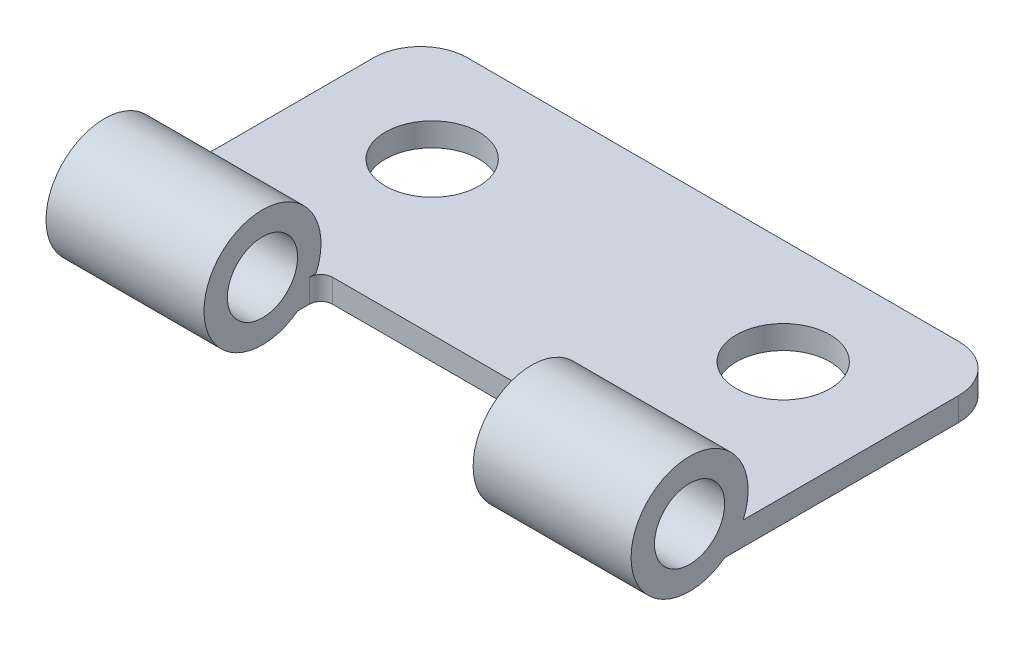
ISO-10303-21;
HEADER;
FILE_DESCRIPTION(('STEP AP214'),'2;1');
FILE_NAME('part.step','',(''),(''),'','','');
FILE_SCHEMA(('AUTOMOTIVE_DESIGN { 1 0 10303 214 1 1 1 1 }'));
ENDSEC;
DATA;
#1=APPLICATION_CONTEXT('core data for automotive mechanical design processes');
#2=APPLICATION_PROTOCOL_DEFINITION('international standard','automotive_design',2000,#1);
#3=PRODUCT_CONTEXT('',#1,'mechanical');
#4=PRODUCT('Part','Part','',(#3));
#5=PRODUCT_RELATED_PRODUCT_CATEGORY('part','',(#4));
#6=PRODUCT_DEFINITION_FORMATION('','',#4);
#7=PRODUCT_DEFINITION_CONTEXT('part definition',#1,'design');
#8=PRODUCT_DEFINITION('design','',#6,#7);
#9=PRODUCT_DEFINITION_SHAPE('','',#8);
#10=(LENGTH_UNIT() NAMED_UNIT(*) SI_UNIT(.MILLI.,.METRE.));
#11=(NAMED_UNIT(*) PLANE_ANGLE_UNIT() SI_UNIT($,.RADIAN.));
#12=(NAMED_UNIT(*) SI_UNIT($,.STERADIAN.) SOLID_ANGLE_UNIT());
#13=UNCERTAINTY_MEASURE_WITH_UNIT(LENGTH_MEASURE(1.E-05),#10,'distance_accuracy_value','');
#14=(GEOMETRIC_REPRESENTATION_CONTEXT(3) GLOBAL_UNCERTAINTY_ASSIGNED_CONTEXT((#13)) GLOBAL_UNIT_ASSIGNED_CONTEXT((#10,
#11,#12)) REPRESENTATION_CONTEXT('',''));
#15=CARTESIAN_POINT('',(0.,0.,0.));
#16=DIRECTION('',(0.,0.,1.));
#17=DIRECTION('',(1.,0.,0.));
#18=AXIS2_PLACEMENT_3D('',#15,#16,#17);
#19=CARTESIAN_POINT('',(0.,1.,0.));
#20=DIRECTION('',(0.,1.,0.));
#21=DIRECTION('',(0.,0.,1.));
#22=AXIS2_PLACEMENT_3D('',#19,#20,#21);
#23=PLANE('',#22);
#24=CARTESIAN_POINT('',(-7.5,1.,-7.5));
#25=DIRECTION('',(0.,1.,0.));
#26=DIRECTION('',(0.,0.,1.));
#27=AXIS2_PLACEMENT_3D('',#24,#25,#26);
#28=CIRCLE('',#27,2.);
#29=CARTESIAN_POINT('',(-7.5,1.,-5.5));
#30=VERTEX_POINT('',#29);
#31=EDGE_CURVE('E169',#30,#30,#28,.T.);
#32=ORIENTED_EDGE('',*,*,#31,.F.);
#33=EDGE_LOOP('',(#32));
#34=FACE_BOUND('',#33,.T.);
#35=CARTESIAN_POINT('',(7.5,1.,-7.5));
#36=DIRECTION('',(0.,1.,0.));
#37=DIRECTION('',(0.,0.,1.));
#38=AXIS2_PLACEMENT_3D('',#35,#36,#37);
#39=CIRCLE('',#38,2.);
#40=CARTESIAN_POINT('',(7.5,1.,-5.50000000000001));
#41=VERTEX_POINT('',#40);
#42=EDGE_CURVE('E256',#41,#41,#39,.T.);
#43=ORIENTED_EDGE('',*,*,#42,.F.);
#44=EDGE_LOOP('',(#43));
#45=FACE_BOUND('',#44,.T.);
#46=CARTESIAN_POINT('',(5.25,1.,-0.5));
#47=DIRECTION('',(0.,1.,0.));
#48=DIRECTION('',(0.,0.,1.));
#49=AXIS2_PLACEMENT_3D('',#46,#47,#48);
#50=CIRCLE('',#49,0.5);
#51=CARTESIAN_POINT('',(5.25,1.,-1.));
#52=VERTEX_POINT('',#51);
#53=CARTESIAN_POINT('',(5.75,1.,-0.5));
#54=VERTEX_POINT('',#53);
#55=EDGE_CURVE('E214',#52,#54,#50,.F.);
#56=ORIENTED_EDGE('',*,*,#55,.T.);
#57=DIRECTION('',(0.,0.,-1.));
#58=VECTOR('',#57,1.);
#59=CARTESIAN_POINT('',(5.75,1.,0.));
#60=LINE('',#59,#58);
#61=CARTESIAN_POINT('',(5.75,1.,-0.791287847477921));
#62=VERTEX_POINT('',#61);
#63=EDGE_CURVE('E143',#54,#62,#60,.T.);
#64=ORIENTED_EDGE('',*,*,#63,.T.);
#65=DIRECTION('',(-1.,0.,0.));
#66=VECTOR('',#65,1.);
#67=CARTESIAN_POINT('',(19.5710678118655,1.,-0.791287847477921));
#68=LINE('',#67,#66);
#69=CARTESIAN_POINT('',(12.5,1.,-0.791287847477921));
#70=VERTEX_POINT('',#69);
#71=EDGE_CURVE('E128',#62,#70,#68,.F.);
#72=ORIENTED_EDGE('',*,*,#71,.T.);
#73=DIRECTION('',(0.,0.,-1.));
#74=VECTOR('',#73,1.);
#75=CARTESIAN_POINT('',(12.5,1.,0.));
#76=LINE('',#75,#74);
#77=CARTESIAN_POINT('',(12.5,1.,-10.));
#78=VERTEX_POINT('',#77);
#79=EDGE_CURVE('E141',#70,#78,#76,.T.);
#80=ORIENTED_EDGE('',*,*,#79,.T.);
#81=CARTESIAN_POINT('',(10.5,1.,-10.));
#82=DIRECTION('',(0.,1.,0.));
#83=DIRECTION('',(0.,0.,1.));
#84=AXIS2_PLACEMENT_3D('',#81,#82,#83);
#85=CIRCLE('',#84,2.);
#86=CARTESIAN_POINT('',(10.5,1.,-12.));
#87=VERTEX_POINT('',#86);
#88=EDGE_CURVE('E196',#78,#87,#85,.T.);
#89=ORIENTED_EDGE('',*,*,#88,.T.);
#90=DIRECTION('',(-1.,0.,0.));
#91=VECTOR('',#90,1.);
#92=CARTESIAN_POINT('',(-12.5,1.,-12.));
#93=LINE('',#92,#91);
#94=CARTESIAN_POINT('',(-10.5,1.,-12.));
#95=VERTEX_POINT('',#94);
#96=EDGE_CURVE('E155',#87,#95,#93,.T.);
#97=ORIENTED_EDGE('',*,*,#96,.T.);
#98=CARTESIAN_POINT('',(-10.5,1.,-10.));
#99=DIRECTION('',(0.,1.,0.));
#100=DIRECTION('',(0.,0.,1.));
#101=AXIS2_PLACEMENT_3D('',#98,#99,#100);
#102=CIRCLE('',#101,2.);
#103=CARTESIAN_POINT('',(-12.5,1.,-10.));
#104=VERTEX_POINT('',#103);
#105=EDGE_CURVE('E198',#95,#104,#102,.T.);
#106=ORIENTED_EDGE('',*,*,#105,.T.);
#107=DIRECTION('',(0.,0.,1.));
#108=VECTOR('',#107,1.);
#109=CARTESIAN_POINT('',(-12.5,1.,-1.));
#110=LINE('',#109,#108);
#111=CARTESIAN_POINT('',(-12.5,1.,-0.791287847477921));
#112=VERTEX_POINT('',#111);
#113=EDGE_CURVE('E62',#104,#112,#110,.T.);
#114=ORIENTED_EDGE('',*,*,#113,.T.);
#115=DIRECTION('',(1.,0.,0.));
#116=VECTOR('',#115,1.);
#117=CARTESIAN_POINT('',(-19.5710678118655,1.,-0.791287847477921));
#118=LINE('',#117,#116);
#119=CARTESIAN_POINT('',(-5.75,1.,-0.791287847477921));
#120=VERTEX_POINT('',#119);
#121=EDGE_CURVE('E57',#112,#120,#118,.T.);
#122=ORIENTED_EDGE('',*,*,#121,.T.);
#123=DIRECTION('',(0.,0.,1.));
#124=VECTOR('',#123,1.);
#125=CARTESIAN_POINT('',(-5.75,1.,0.));
#126=LINE('',#125,#124);
#127=CARTESIAN_POINT('',(-5.75,1.,-0.500000000000001));
#128=VERTEX_POINT('',#127);
#129=EDGE_CURVE('E233',#120,#128,#126,.T.);
#130=ORIENTED_EDGE('',*,*,#129,.T.);
#131=CARTESIAN_POINT('',(-5.25,1.,-0.500000000000001));
#132=DIRECTION('',(0.,1.,0.));
#133=DIRECTION('',(0.,0.,1.));
#134=AXIS2_PLACEMENT_3D('',#131,#132,#133);
#135=CIRCLE('',#134,0.5);
#136=CARTESIAN_POINT('',(-5.25,1.,-1.));
#137=VERTEX_POINT('',#136);
#138=EDGE_CURVE('E11',#128,#137,#135,.F.);
#139=ORIENTED_EDGE('',*,*,#138,.T.);
#140=DIRECTION('',(1.,0.,0.));
#141=VECTOR('',#140,1.);
#142=CARTESIAN_POINT('',(-5.75,1.,-1.));
#143=LINE('',#142,#141);
#144=EDGE_CURVE('E153',#137,#52,#143,.T.);
#145=ORIENTED_EDGE('',*,*,#144,.T.);
#146=EDGE_LOOP('',(#56,#64,#72,#80,#89,#97,#106,#114,#122,#130,#139,#145));
#147=FACE_BOUND('',#146,.T.);
#148=ADVANCED_FACE('F41',(#34,#45,#147),#23,.T.);
#149=CARTESIAN_POINT('',(0.,0.,0.));
#150=DIRECTION('',(0.,1.,0.));
#151=DIRECTION('',(0.,0.,1.));
#152=AXIS2_PLACEMENT_3D('',#149,#150,#151);
#153=PLANE('',#152);
#154=DIRECTION('',(0.,0.,1.));
#155=VECTOR('',#154,1.);
#156=CARTESIAN_POINT('',(-12.5,0.,-1.));
#157=LINE('',#156,#155);
#158=CARTESIAN_POINT('',(-12.5,0.,-10.));
#159=VERTEX_POINT('',#158);
#160=CARTESIAN_POINT('',(-12.5,0.,0.));
#161=VERTEX_POINT('',#160);
#162=EDGE_CURVE('E158',#159,#161,#157,.T.);
#163=ORIENTED_EDGE('',*,*,#162,.F.);
#164=CARTESIAN_POINT('',(-10.5,0.,-10.));
#165=DIRECTION('',(0.,1.,0.));
#166=DIRECTION('',(0.,0.,1.));
#167=AXIS2_PLACEMENT_3D('',#164,#165,#166);
#168=CIRCLE('',#167,2.);
#169=CARTESIAN_POINT('',(-10.5,0.,-12.));
#170=VERTEX_POINT('',#169);
#171=EDGE_CURVE('E188',#159,#170,#168,.F.);
#172=ORIENTED_EDGE('',*,*,#171,.T.);
#173=DIRECTION('',(-1.,0.,0.));
#174=VECTOR('',#173,1.);
#175=CARTESIAN_POINT('',(-12.5,0.,-12.));
#176=LINE('',#175,#174);
#177=CARTESIAN_POINT('',(10.5,0.,-12.));
#178=VERTEX_POINT('',#177);
#179=EDGE_CURVE('E181',#178,#170,#176,.T.);
#180=ORIENTED_EDGE('',*,*,#179,.F.);
#181=CARTESIAN_POINT('',(10.5,0.,-10.));
#182=DIRECTION('',(0.,1.,0.));
#183=DIRECTION('',(0.,0.,1.));
#184=AXIS2_PLACEMENT_3D('',#181,#182,#183);
#185=CIRCLE('',#184,2.);
#186=CARTESIAN_POINT('',(12.5,0.,-10.));
#187=VERTEX_POINT('',#186);
#188=EDGE_CURVE('E189',#178,#187,#185,.F.);
#189=ORIENTED_EDGE('',*,*,#188,.T.);
#190=DIRECTION('',(0.,0.,-1.));
#191=VECTOR('',#190,1.);
#192=CARTESIAN_POINT('',(12.5,0.,-12.));
#193=LINE('',#192,#191);
#194=CARTESIAN_POINT('',(12.5,0.,0.));
#195=VERTEX_POINT('',#194);
#196=EDGE_CURVE('E177',#195,#187,#193,.T.);
#197=ORIENTED_EDGE('',*,*,#196,.F.);
#198=DIRECTION('',(1.,0.,0.));
#199=VECTOR('',#198,1.);
#200=CARTESIAN_POINT('',(5.75,0.,0.));
#201=LINE('',#200,#199);
#202=CARTESIAN_POINT('',(5.75,0.,0.));
#203=VERTEX_POINT('',#202);
#204=EDGE_CURVE('E135',#203,#195,#201,.T.);
#205=ORIENTED_EDGE('',*,*,#204,.F.);
#206=DIRECTION('',(0.,0.,1.));
#207=VECTOR('',#206,1.);
#208=CARTESIAN_POINT('',(5.75,0.,-1.));
#209=LINE('',#208,#207);
#210=CARTESIAN_POINT('',(5.75,0.,-0.5));
#211=VERTEX_POINT('',#210);
#212=EDGE_CURVE('E174',#211,#203,#209,.T.);
#213=ORIENTED_EDGE('',*,*,#212,.F.);
#214=CARTESIAN_POINT('',(5.25,0.,-0.5));
#215=DIRECTION('',(0.,1.,0.));
#216=DIRECTION('',(0.,0.,1.));
#217=AXIS2_PLACEMENT_3D('',#214,#215,#216);
#218=CIRCLE('',#217,0.5);
#219=CARTESIAN_POINT('',(5.25,0.,-1.));
#220=VERTEX_POINT('',#219);
#221=EDGE_CURVE('E212',#211,#220,#218,.T.);
#222=ORIENTED_EDGE('',*,*,#221,.T.);
#223=DIRECTION('',(1.,0.,0.));
#224=VECTOR('',#223,1.);
#225=CARTESIAN_POINT('',(-5.75,0.,-1.));
#226=LINE('',#225,#224);
#227=CARTESIAN_POINT('',(-5.25,0.,-1.));
#228=VERTEX_POINT('',#227);
#229=EDGE_CURVE('E175',#228,#220,#226,.T.);
#230=ORIENTED_EDGE('',*,*,#229,.F.);
#231=CARTESIAN_POINT('',(-5.25,0.,-0.500000000000001));
#232=DIRECTION('',(0.,1.,0.));
#233=DIRECTION('',(0.,0.,1.));
#234=AXIS2_PLACEMENT_3D('',#231,#232,#233);
#235=CIRCLE('',#234,0.5);
#236=CARTESIAN_POINT('',(-5.75,0.,-0.500000000000001));
#237=VERTEX_POINT('',#236);
#238=EDGE_CURVE('E47',#228,#237,#235,.T.);
#239=ORIENTED_EDGE('',*,*,#238,.T.);
#240=DIRECTION('',(0.,0.,-1.));
#241=VECTOR('',#240,1.);
#242=CARTESIAN_POINT('',(-5.75,0.,0.));
#243=LINE('',#242,#241);
#244=CARTESIAN_POINT('',(-5.75,0.,0.));
#245=VERTEX_POINT('',#244);
#246=EDGE_CURVE('E166',#245,#237,#243,.T.);
#247=ORIENTED_EDGE('',*,*,#246,.F.);
#248=DIRECTION('',(1.,0.,0.));
#249=VECTOR('',#248,1.);
#250=CARTESIAN_POINT('',(-12.5,0.,0.));
#251=LINE('',#250,#249);
#252=EDGE_CURVE('E164',#161,#245,#251,.T.);
#253=ORIENTED_EDGE('',*,*,#252,.F.);
#254=EDGE_LOOP('',(#163,#172,#180,#189,#197,#205,#213,#222,#230,#239,#247,#253));
#255=FACE_BOUND('',#254,.T.);
#256=CARTESIAN_POINT('',(-7.5,0.,-7.5));
#257=DIRECTION('',(0.,1.,0.));
#258=DIRECTION('',(0.,0.,1.));
#259=AXIS2_PLACEMENT_3D('',#256,#257,#258);
#260=CIRCLE('',#259,2.);
#261=CARTESIAN_POINT('',(-7.5,0.,-5.5));
#262=VERTEX_POINT('',#261);
#263=EDGE_CURVE('E261',#262,#262,#260,.T.);
#264=ORIENTED_EDGE('',*,*,#263,.T.);
#265=EDGE_LOOP('',(#264));
#266=FACE_BOUND('',#265,.T.);
#267=CARTESIAN_POINT('',(7.5,0.,-7.5));
#268=DIRECTION('',(0.,1.,0.));
#269=DIRECTION('',(0.,0.,1.));
#270=AXIS2_PLACEMENT_3D('',#267,#268,#269);
#271=CIRCLE('',#270,2.);
#272=CARTESIAN_POINT('',(7.5,0.,-5.50000000000001));
#273=VERTEX_POINT('',#272);
#274=EDGE_CURVE('E259',#273,#273,#271,.T.);
#275=ORIENTED_EDGE('',*,*,#274,.T.);
#276=EDGE_LOOP('',(#275));
#277=FACE_BOUND('',#276,.T.);
#278=ADVANCED_FACE('F216',(#255,#266,#277),#153,.F.);
#279=CARTESIAN_POINT('',(-5.75,1.,0.));
#280=DIRECTION('',(-1.,0.,0.));
#281=DIRECTION('',(0.,0.,1.));
#282=AXIS2_PLACEMENT_3D('',#279,#280,#281);
#283=PLANE('',#282);
#284=DIRECTION('',(0.,-1.,0.));
#285=VECTOR('',#284,1.);
#286=CARTESIAN_POINT('',(-5.75,1.,-0.500000000000001));
#287=LINE('',#286,#285);
#288=EDGE_CURVE('E209',#237,#128,#287,.F.);
#289=ORIENTED_EDGE('',*,*,#288,.T.);
#290=ORIENTED_EDGE('',*,*,#129,.F.);
#291=CARTESIAN_POINT('',(-5.75,2.,1.5));
#292=DIRECTION('',(-1.,0.,0.));
#293=DIRECTION('',(0.,0.,1.));
#294=AXIS2_PLACEMENT_3D('',#291,#292,#293);
#295=CIRCLE('',#294,2.5);
#296=EDGE_CURVE('E227',#245,#120,#295,.T.);
#297=ORIENTED_EDGE('',*,*,#296,.F.);
#298=ORIENTED_EDGE('',*,*,#246,.T.);
#299=EDGE_LOOP('',(#289,#290,#297,#298));
#300=FACE_BOUND('',#299,.T.);
#301=CARTESIAN_POINT('',(-5.75,2.,1.5));
#302=DIRECTION('',(-1.,0.,0.));
#303=DIRECTION('',(0.,0.,1.));
#304=AXIS2_PLACEMENT_3D('',#301,#302,#303);
#305=CIRCLE('',#304,1.5);
#306=CARTESIAN_POINT('',(-5.75,2.,3.));
#307=VERTEX_POINT('',#306);
#308=EDGE_CURVE('E243',#307,#307,#305,.T.);
#309=ORIENTED_EDGE('',*,*,#308,.T.);
#310=EDGE_LOOP('',(#309));
#311=FACE_BOUND('',#310,.T.);
#312=ADVANCED_FACE('F223',(#300,#311),#283,.F.);
#313=CARTESIAN_POINT('',(-5.75,1.,-1.));
#314=DIRECTION('',(0.,0.,-1.));
#315=DIRECTION('',(-1.,0.,0.));
#316=AXIS2_PLACEMENT_3D('',#313,#314,#315);
#317=PLANE('',#316);
#318=ORIENTED_EDGE('',*,*,#229,.T.);
#319=DIRECTION('',(0.,-1.,0.));
#320=VECTOR('',#319,1.);
#321=CARTESIAN_POINT('',(5.25,1.,-1.));
#322=LINE('',#321,#320);
#323=EDGE_CURVE('E210',#220,#52,#322,.F.);
#324=ORIENTED_EDGE('',*,*,#323,.T.);
#325=ORIENTED_EDGE('',*,*,#144,.F.);
#326=DIRECTION('',(0.,-1.,0.));
#327=VECTOR('',#326,1.);
#328=CARTESIAN_POINT('',(-5.25,0.,-1.));
#329=LINE('',#328,#327);
#330=EDGE_CURVE('E203',#137,#228,#329,.T.);
#331=ORIENTED_EDGE('',*,*,#330,.T.);
#332=EDGE_LOOP('',(#318,#324,#325,#331));
#333=FACE_BOUND('',#332,.T.);
#334=ADVANCED_FACE('F231',(#333),#317,.F.);
#335=CARTESIAN_POINT('',(5.75,1.,-1.));
#336=DIRECTION('',(1.,0.,0.));
#337=DIRECTION('',(0.,0.,-1.));
#338=AXIS2_PLACEMENT_3D('',#335,#336,#337);
#339=PLANE('',#338);
#340=ORIENTED_EDGE('',*,*,#212,.T.);
#341=CARTESIAN_POINT('',(5.75,2.,1.5));
#342=DIRECTION('',(1.,0.,0.));
#343=DIRECTION('',(0.,0.,-1.));
#344=AXIS2_PLACEMENT_3D('',#341,#342,#343);
#345=CIRCLE('',#344,2.5);
#346=EDGE_CURVE('E139',#62,#203,#345,.T.);
#347=ORIENTED_EDGE('',*,*,#346,.F.);
#348=ORIENTED_EDGE('',*,*,#63,.F.);
#349=DIRECTION('',(0.,-1.,0.));
#350=VECTOR('',#349,1.);
#351=CARTESIAN_POINT('',(5.75,0.,-0.5));
#352=LINE('',#351,#350);
#353=EDGE_CURVE('E202',#54,#211,#352,.T.);
#354=ORIENTED_EDGE('',*,*,#353,.T.);
#355=EDGE_LOOP('',(#340,#347,#348,#354));
#356=FACE_BOUND('',#355,.T.);
#357=CARTESIAN_POINT('',(5.75,2.,1.5));
#358=DIRECTION('',(1.,0.,0.));
#359=DIRECTION('',(0.,0.,-1.));
#360=AXIS2_PLACEMENT_3D('',#357,#358,#359);
#361=CIRCLE('',#360,1.5);
#362=CARTESIAN_POINT('',(5.75,2.,0.));
#363=VERTEX_POINT('',#362);
#364=EDGE_CURVE('E138',#363,#363,#361,.T.);
#365=ORIENTED_EDGE('',*,*,#364,.T.);
#366=EDGE_LOOP('',(#365));
#367=FACE_BOUND('',#366,.T.);
#368=ADVANCED_FACE('F241',(#356,#367),#339,.F.);
#369=CARTESIAN_POINT('',(12.5,1.,-12.));
#370=DIRECTION('',(-1.,0.,0.));
#371=DIRECTION('',(0.,0.,1.));
#372=AXIS2_PLACEMENT_3D('',#369,#370,#371);
#373=PLANE('',#372);
#374=ORIENTED_EDGE('',*,*,#79,.F.);
#375=CARTESIAN_POINT('',(12.5,2.,1.5));
#376=DIRECTION('',(-1.,0.,0.));
#377=DIRECTION('',(0.,0.,1.));
#378=AXIS2_PLACEMENT_3D('',#375,#376,#377);
#379=CIRCLE('',#378,2.5);
#380=EDGE_CURVE('E130',#195,#70,#379,.T.);
#381=ORIENTED_EDGE('',*,*,#380,.F.);
#382=ORIENTED_EDGE('',*,*,#196,.T.);
#383=DIRECTION('',(0.,-1.,0.));
#384=VECTOR('',#383,1.);
#385=CARTESIAN_POINT('',(12.5,1.,-10.));
#386=LINE('',#385,#384);
#387=EDGE_CURVE('E154',#187,#78,#386,.F.);
#388=ORIENTED_EDGE('',*,*,#387,.T.);
#389=EDGE_LOOP('',(#374,#381,#382,#388));
#390=FACE_BOUND('',#389,.T.);
#391=CARTESIAN_POINT('',(12.5,2.,1.5));
#392=DIRECTION('',(-1.,0.,0.));
#393=DIRECTION('',(0.,0.,1.));
#394=AXIS2_PLACEMENT_3D('',#391,#392,#393);
#395=CIRCLE('',#394,1.5);
#396=CARTESIAN_POINT('',(12.5,2.,3.));
#397=VERTEX_POINT('',#396);
#398=EDGE_CURVE('E147',#397,#397,#395,.T.);
#399=ORIENTED_EDGE('',*,*,#398,.T.);
#400=EDGE_LOOP('',(#399));
#401=FACE_BOUND('',#400,.T.);
#402=ADVANCED_FACE('F149',(#390,#401),#373,.F.);
#403=CARTESIAN_POINT('',(-12.5,1.,-12.));
#404=DIRECTION('',(0.,0.,1.));
#405=DIRECTION('',(1.,0.,0.));
#406=AXIS2_PLACEMENT_3D('',#403,#404,#405);
#407=PLANE('',#406);
#408=ORIENTED_EDGE('',*,*,#179,.T.);
#409=DIRECTION('',(0.,-1.,0.));
#410=VECTOR('',#409,1.);
#411=CARTESIAN_POINT('',(-10.5,1.,-12.));
#412=LINE('',#411,#410);
#413=EDGE_CURVE('E193',#170,#95,#412,.F.);
#414=ORIENTED_EDGE('',*,*,#413,.T.);
#415=ORIENTED_EDGE('',*,*,#96,.F.);
#416=DIRECTION('',(0.,-1.,0.));
#417=VECTOR('',#416,1.);
#418=CARTESIAN_POINT('',(10.5,1.,-12.));
#419=LINE('',#418,#417);
#420=EDGE_CURVE('E195',#87,#178,#419,.T.);
#421=ORIENTED_EDGE('',*,*,#420,.T.);
#422=EDGE_LOOP('',(#408,#414,#415,#421));
#423=FACE_BOUND('',#422,.T.);
#424=ADVANCED_FACE('F285',(#423),#407,.F.);
#425=CARTESIAN_POINT('',(-12.5,1.,-1.));
#426=DIRECTION('',(1.,0.,0.));
#427=DIRECTION('',(0.,0.,-1.));
#428=AXIS2_PLACEMENT_3D('',#425,#426,#427);
#429=PLANE('',#428);
#430=ORIENTED_EDGE('',*,*,#162,.T.);
#431=CARTESIAN_POINT('',(-12.5,2.,1.5));
#432=DIRECTION('',(1.,0.,0.));
#433=DIRECTION('',(0.,0.,-1.));
#434=AXIS2_PLACEMENT_3D('',#431,#432,#433);
#435=CIRCLE('',#434,2.5);
#436=EDGE_CURVE('E246',#112,#161,#435,.T.);
#437=ORIENTED_EDGE('',*,*,#436,.F.);
#438=ORIENTED_EDGE('',*,*,#113,.F.);
#439=DIRECTION('',(0.,-1.,0.));
#440=VECTOR('',#439,1.);
#441=CARTESIAN_POINT('',(-12.5,1.,-10.));
#442=LINE('',#441,#440);
#443=EDGE_CURVE('E165',#104,#159,#442,.T.);
#444=ORIENTED_EDGE('',*,*,#443,.T.);
#445=EDGE_LOOP('',(#430,#437,#438,#444));
#446=FACE_BOUND('',#445,.T.);
#447=CARTESIAN_POINT('',(-12.5,2.,1.5));
#448=DIRECTION('',(1.,0.,0.));
#449=DIRECTION('',(0.,0.,-1.));
#450=AXIS2_PLACEMENT_3D('',#447,#448,#449);
#451=CIRCLE('',#450,1.5);
#452=CARTESIAN_POINT('',(-12.5,2.,0.));
#453=VERTEX_POINT('',#452);
#454=EDGE_CURVE('E249',#453,#453,#451,.T.);
#455=ORIENTED_EDGE('',*,*,#454,.T.);
#456=EDGE_LOOP('',(#455));
#457=FACE_BOUND('',#456,.T.);
#458=ADVANCED_FACE('F271',(#446,#457),#429,.F.);
#459=CARTESIAN_POINT('',(-7.5,1.,-7.5));
#460=DIRECTION('',(0.,-1.,0.));
#461=DIRECTION('',(0.,0.,-1.));
#462=AXIS2_PLACEMENT_3D('',#459,#460,#461);
#463=CYLINDRICAL_SURFACE('',#462,2.);
#464=ORIENTED_EDGE('',*,*,#31,.T.);
#465=EDGE_LOOP('',(#464));
#466=FACE_BOUND('',#465,.T.);
#467=ORIENTED_EDGE('',*,*,#263,.F.);
#468=EDGE_LOOP('',(#467));
#469=FACE_BOUND('',#468,.T.);
#470=ADVANCED_FACE('F270',(#466,#469),#463,.F.);
#471=CARTESIAN_POINT('',(7.5,1.,-7.5));
#472=DIRECTION('',(0.,-1.,0.));
#473=DIRECTION('',(0.,0.,-1.));
#474=AXIS2_PLACEMENT_3D('',#471,#472,#473);
#475=CYLINDRICAL_SURFACE('',#474,2.);
#476=ORIENTED_EDGE('',*,*,#42,.T.);
#477=EDGE_LOOP('',(#476));
#478=FACE_BOUND('',#477,.T.);
#479=ORIENTED_EDGE('',*,*,#274,.F.);
#480=EDGE_LOOP('',(#479));
#481=FACE_BOUND('',#480,.T.);
#482=ADVANCED_FACE('F275',(#478,#481),#475,.F.);
#483=CARTESIAN_POINT('',(-10.5,1.,-10.));
#484=DIRECTION('',(0.,-1.,0.));
#485=DIRECTION('',(0.,0.,-1.));
#486=AXIS2_PLACEMENT_3D('',#483,#484,#485);
#487=CYLINDRICAL_SURFACE('',#486,2.);
#488=ORIENTED_EDGE('',*,*,#105,.F.);
#489=ORIENTED_EDGE('',*,*,#413,.F.);
#490=ORIENTED_EDGE('',*,*,#171,.F.);
#491=ORIENTED_EDGE('',*,*,#443,.F.);
#492=EDGE_LOOP('',(#488,#489,#490,#491));
#493=FACE_BOUND('',#492,.T.);
#494=ADVANCED_FACE('F276',(#493),#487,.T.);
#495=CARTESIAN_POINT('',(10.5,1.,-10.));
#496=DIRECTION('',(0.,-1.,0.));
#497=DIRECTION('',(0.,0.,-1.));
#498=AXIS2_PLACEMENT_3D('',#495,#496,#497);
#499=CYLINDRICAL_SURFACE('',#498,2.);
#500=ORIENTED_EDGE('',*,*,#88,.F.);
#501=ORIENTED_EDGE('',*,*,#387,.F.);
#502=ORIENTED_EDGE('',*,*,#188,.F.);
#503=ORIENTED_EDGE('',*,*,#420,.F.);
#504=EDGE_LOOP('',(#500,#501,#502,#503));
#505=FACE_BOUND('',#504,.T.);
#506=ADVANCED_FACE('F309',(#505),#499,.T.);
#507=CARTESIAN_POINT('',(5.25,1.,-0.5));
#508=DIRECTION('',(0.,1.,0.));
#509=DIRECTION('',(0.,0.,1.));
#510=AXIS2_PLACEMENT_3D('',#507,#508,#509);
#511=CYLINDRICAL_SURFACE('',#510,0.5);
#512=ORIENTED_EDGE('',*,*,#55,.F.);
#513=ORIENTED_EDGE('',*,*,#323,.F.);
#514=ORIENTED_EDGE('',*,*,#221,.F.);
#515=ORIENTED_EDGE('',*,*,#353,.F.);
#516=EDGE_LOOP('',(#512,#513,#514,#515));
#517=FACE_BOUND('',#516,.T.);
#518=ADVANCED_FACE('F240',(#517),#511,.F.);
#519=CARTESIAN_POINT('',(-5.25,1.,-0.500000000000001));
#520=DIRECTION('',(0.,1.,0.));
#521=DIRECTION('',(0.,0.,1.));
#522=AXIS2_PLACEMENT_3D('',#519,#520,#521);
#523=CYLINDRICAL_SURFACE('',#522,0.5);
#524=ORIENTED_EDGE('',*,*,#138,.F.);
#525=ORIENTED_EDGE('',*,*,#288,.F.);
#526=ORIENTED_EDGE('',*,*,#238,.F.);
#527=ORIENTED_EDGE('',*,*,#330,.F.);
#528=EDGE_LOOP('',(#524,#525,#526,#527));
#529=FACE_BOUND('',#528,.T.);
#530=ADVANCED_FACE('F43',(#529),#523,.F.);
#531=CARTESIAN_POINT('',(-19.5710678118655,2.,1.5));
#532=DIRECTION('',(1.,0.,0.));
#533=DIRECTION('',(0.,0.,-1.));
#534=AXIS2_PLACEMENT_3D('',#531,#532,#533);
#535=CYLINDRICAL_SURFACE('',#534,2.5);
#536=ORIENTED_EDGE('',*,*,#121,.F.);
#537=ORIENTED_EDGE('',*,*,#436,.T.);
#538=ORIENTED_EDGE('',*,*,#252,.T.);
#539=ORIENTED_EDGE('',*,*,#296,.T.);
#540=EDGE_LOOP('',(#536,#537,#538,#539));
#541=FACE_BOUND('',#540,.T.);
#542=ADVANCED_FACE('F316',(#541),#535,.T.);
#543=CARTESIAN_POINT('',(-19.5710678118655,2.,1.5));
#544=DIRECTION('',(1.,0.,0.));
#545=DIRECTION('',(0.,0.,-1.));
#546=AXIS2_PLACEMENT_3D('',#543,#544,#545);
#547=CYLINDRICAL_SURFACE('',#546,1.5);
#548=ORIENTED_EDGE('',*,*,#454,.F.);
#549=EDGE_LOOP('',(#548));
#550=FACE_BOUND('',#549,.T.);
#551=ORIENTED_EDGE('',*,*,#308,.F.);
#552=EDGE_LOOP('',(#551));
#553=FACE_BOUND('',#552,.T.);
#554=ADVANCED_FACE('F324',(#550,#553),#547,.F.);
#555=CARTESIAN_POINT('',(19.5710678118655,2.,1.5));
#556=DIRECTION('',(-1.,0.,0.));
#557=DIRECTION('',(0.,0.,1.));
#558=AXIS2_PLACEMENT_3D('',#555,#556,#557);
#559=CYLINDRICAL_SURFACE('',#558,2.5);
#560=ORIENTED_EDGE('',*,*,#71,.F.);
#561=ORIENTED_EDGE('',*,*,#346,.T.);
#562=ORIENTED_EDGE('',*,*,#204,.T.);
#563=ORIENTED_EDGE('',*,*,#380,.T.);
#564=EDGE_LOOP('',(#560,#561,#562,#563));
#565=FACE_BOUND('',#564,.T.);
#566=ADVANCED_FACE('F126',(#565),#559,.T.);
#567=CARTESIAN_POINT('',(19.5710678118655,2.,1.5));
#568=DIRECTION('',(-1.,0.,0.));
#569=DIRECTION('',(0.,0.,1.));
#570=AXIS2_PLACEMENT_3D('',#567,#568,#569);
#571=CYLINDRICAL_SURFACE('',#570,1.5);
#572=ORIENTED_EDGE('',*,*,#398,.F.);
#573=EDGE_LOOP('',(#572));
#574=FACE_BOUND('',#573,.T.);
#575=ORIENTED_EDGE('',*,*,#364,.F.);
#576=EDGE_LOOP('',(#575));
#577=FACE_BOUND('',#576,.T.);
#578=ADVANCED_FACE('F331',(#574,#577),#571,.F.);
#579=CLOSED_SHELL('',(#148,#278,#312,#334,#368,#402,#424,#458,#470,#482,#494,#506,#518,#530,
#542,#554,#566,#578));
#580=MANIFOLD_SOLID_BREP('B2',#579);
#581=ADVANCED_BREP_SHAPE_REPRESENTATION('',(#18,#580),#14);
#582=SHAPE_DEFINITION_REPRESENTATION(#9,#581);
ENDSEC;
END-ISO-10303-21;
